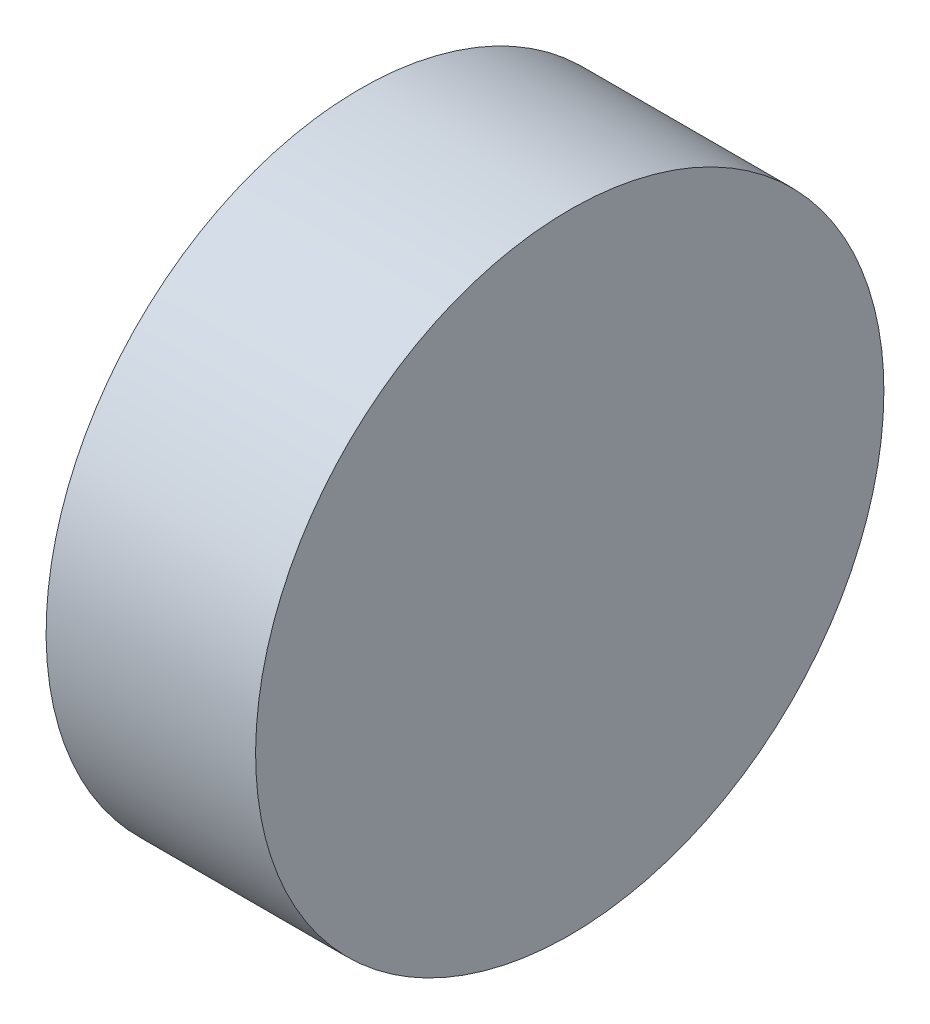
ISO-10303-21;
HEADER;
FILE_DESCRIPTION(('STEP AP214'),'2;1');
FILE_NAME('part.step','',(''),(''),'','','');
FILE_SCHEMA(('AUTOMOTIVE_DESIGN { 1 0 10303 214 1 1 1 1 }'));
ENDSEC;
DATA;
#1=APPLICATION_CONTEXT('core data for automotive mechanical design processes');
#2=APPLICATION_PROTOCOL_DEFINITION('international standard','automotive_design',2000,#1);
#3=PRODUCT_CONTEXT('',#1,'mechanical');
#4=PRODUCT('Part','Part','',(#3));
#5=PRODUCT_RELATED_PRODUCT_CATEGORY('part','',(#4));
#6=PRODUCT_DEFINITION_FORMATION('','',#4);
#7=PRODUCT_DEFINITION_CONTEXT('part definition',#1,'design');
#8=PRODUCT_DEFINITION('design','',#6,#7);
#9=PRODUCT_DEFINITION_SHAPE('','',#8);
#10=(LENGTH_UNIT() NAMED_UNIT(*) SI_UNIT(.MILLI.,.METRE.));
#11=(NAMED_UNIT(*) PLANE_ANGLE_UNIT() SI_UNIT($,.RADIAN.));
#12=(NAMED_UNIT(*) SI_UNIT($,.STERADIAN.) SOLID_ANGLE_UNIT());
#13=UNCERTAINTY_MEASURE_WITH_UNIT(LENGTH_MEASURE(1.E-05),#10,'distance_accuracy_value','');
#14=(GEOMETRIC_REPRESENTATION_CONTEXT(3) GLOBAL_UNCERTAINTY_ASSIGNED_CONTEXT((#13)) GLOBAL_UNIT_ASSIGNED_CONTEXT((#10,
#11,#12)) REPRESENTATION_CONTEXT('',''));
#15=CARTESIAN_POINT('',(0.,0.,0.));
#16=DIRECTION('',(0.,0.,1.));
#17=DIRECTION('',(1.,0.,0.));
#18=AXIS2_PLACEMENT_3D('',#15,#16,#17);
#19=CARTESIAN_POINT('',(480.480844217991,7.63540448629353,-6.68384776311004));
#20=CARTESIAN_POINT('',(480.480844217991,8.07285767052129,-6.68384776311004));
#21=CARTESIAN_POINT('',(480.480844217991,8.9477640389768,-6.59767700707474));
#22=CARTESIAN_POINT('',(480.480844217991,10.2096903500302,-6.21487584565985));
#23=CARTESIAN_POINT('',(480.480844217991,11.3726882990163,-5.59324049083884));
#24=CARTESIAN_POINT('',(480.480844217991,12.3920645269724,-4.75666004068037));
#25=CARTESIAN_POINT('',(480.480844217991,13.2286449771308,-3.73728381272428));
#26=CARTESIAN_POINT('',(480.480844217991,13.8502803319518,-2.57428586373817));
#27=CARTESIAN_POINT('',(480.480844217991,14.2330814933667,-1.3123595526848));
#28=CARTESIAN_POINT('',(480.480844217991,14.3623376274197,-1.53851373328506E-12));
#29=CARTESIAN_POINT('',(480.480844217991,14.2330814933667,1.31235955268173));
#30=CARTESIAN_POINT('',(480.480844217991,13.8502803319518,2.57428586373509));
#31=CARTESIAN_POINT('',(480.480844217991,13.2286449771308,3.7372838127212));
#32=CARTESIAN_POINT('',(480.480844217991,12.3920645269724,4.75666004067729));
#33=CARTESIAN_POINT('',(480.480844217991,11.3726882990163,5.59324049083577));
#34=CARTESIAN_POINT('',(480.480844217991,10.2096903500302,6.21487584565678));
#35=CARTESIAN_POINT('',(480.480844217991,8.9477640389768,6.59767700707166));
#36=CARTESIAN_POINT('',(480.480844217991,7.63540448629353,6.72693314112462));
#37=CARTESIAN_POINT('',(480.480844217991,6.32304493361027,6.59767700707166));
#38=CARTESIAN_POINT('',(480.480844217991,5.0611186225569,6.21487584565677));
#39=CARTESIAN_POINT('',(480.480844217991,3.8981206735708,5.59324049083577));
#40=CARTESIAN_POINT('',(480.480844217991,2.8787444456147,4.75666004067729));
#41=CARTESIAN_POINT('',(480.480844217991,2.04216399545623,3.7372838127212));
#42=CARTESIAN_POINT('',(480.480844217991,1.42052864063522,2.5742858637351));
#43=CARTESIAN_POINT('',(480.480844217991,1.03772747922033,1.31235955268173));
#44=CARTESIAN_POINT('',(480.480844217991,0.908471345167377,-1.53361543439531E-12));
#45=CARTESIAN_POINT('',(480.480844217991,1.03772747922034,-1.31235955268481));
#46=CARTESIAN_POINT('',(480.480844217991,1.42052864063522,-2.57428586373817));
#47=CARTESIAN_POINT('',(480.480844217991,2.04216399545623,-3.73728381272428));
#48=CARTESIAN_POINT('',(480.480844217991,2.8787444456147,-4.75666004068036));
#49=CARTESIAN_POINT('',(480.480844217991,3.89812067357079,-5.59324049083884));
#50=CARTESIAN_POINT('',(480.480844217991,5.0611186225569,-6.21487584565985));
#51=CARTESIAN_POINT('',(480.480844217991,6.32304493361026,-6.59767700707473));
#52=CARTESIAN_POINT('',(480.480844217991,7.19795130206578,-6.68384776311004));
#53=CARTESIAN_POINT('',(480.480844217991,7.63540448629353,-6.68384776311004));
#54=B_SPLINE_CURVE_WITH_KNOTS('',3,(#19,#20,#21,#22,#23,#24,#25,#26,#27,#28,#29,#30,#31,#32,#33,
#34,#35,#36,#37,#38,#39,#40,#41,#42,#43,#44,#45,#46,#47,#48,#49,#50,#51,#52,#53),.UNSPECIFIED.,
.T.,.F.,(4,1,1,1,1,1,1,1,1,1,1,1,1,1,1,1,1,1,1,1,1,1,1,1,1,1,1,1,1,1,1,1,4),(0.,0.03125,0.0625,
0.09375,0.125,0.15625,0.1875,0.21875,0.25,0.28125,0.3125,0.34375,0.375,0.40625,0.4375,0.46875,
0.5,0.53125,0.5625,0.59375,0.625,0.65625,0.6875,0.71875,0.75,0.78125,0.8125,0.84375,0.875,
0.90625,0.9375,0.96875,1.),.UNSPECIFIED.);
#55=DIRECTION('',(1.,0.,0.));
#56=VECTOR('',#55,1.);
#57=SURFACE_OF_LINEAR_EXTRUSION('',#54,#56);
#58=CARTESIAN_POINT('',(480.480844217991,7.63540448629353,-6.68384776311004));
#59=CARTESIAN_POINT('',(480.480844217991,8.07285767052129,-6.68384776311004));
#60=CARTESIAN_POINT('',(480.48084421799,8.9477640389768,-6.59767700707474));
#61=CARTESIAN_POINT('',(480.480844217991,10.2096903500302,-6.21487584565985));
#62=CARTESIAN_POINT('',(480.480844217991,11.3726882990163,-5.59324049083884));
#63=CARTESIAN_POINT('',(480.480844217991,12.3920645269724,-4.75666004068037));
#64=CARTESIAN_POINT('',(480.480844217991,13.2286449771308,-3.73728381272428));
#65=CARTESIAN_POINT('',(480.480844217991,13.8502803319518,-2.57428586373817));
#66=CARTESIAN_POINT('',(480.480844217991,14.2330814933667,-1.3123595526848));
#67=CARTESIAN_POINT('',(480.480844217991,14.3623376274197,-1.53851373328506E-12));
#68=CARTESIAN_POINT('',(480.480844217991,14.2330814933667,1.31235955268173));
#69=CARTESIAN_POINT('',(480.480844217991,13.8502803319518,2.57428586373509));
#70=CARTESIAN_POINT('',(480.480844217991,13.2286449771308,3.7372838127212));
#71=CARTESIAN_POINT('',(480.480844217991,12.3920645269724,4.75666004067729));
#72=CARTESIAN_POINT('',(480.48084421799,11.3726882990163,5.59324049083577));
#73=CARTESIAN_POINT('',(480.480844217991,10.2096903500302,6.21487584565678));
#74=CARTESIAN_POINT('',(480.480844217991,8.9477640389768,6.59767700707166));
#75=CARTESIAN_POINT('',(480.480844217991,7.63540448629353,6.72693314112462));
#76=CARTESIAN_POINT('',(480.480844217991,6.32304493361027,6.59767700707166));
#77=CARTESIAN_POINT('',(480.48084421799,5.0611186225569,6.21487584565677));
#78=CARTESIAN_POINT('',(480.480844217991,3.8981206735708,5.59324049083577));
#79=CARTESIAN_POINT('',(480.480844217991,2.8787444456147,4.75666004067729));
#80=CARTESIAN_POINT('',(480.48084421799,2.04216399545623,3.7372838127212));
#81=CARTESIAN_POINT('',(480.480844217991,1.42052864063522,2.5742858637351));
#82=CARTESIAN_POINT('',(480.48084421799,1.03772747922033,1.31235955268173));
#83=CARTESIAN_POINT('',(480.48084421799,0.908471345167377,-1.53361543439531E-12));
#84=CARTESIAN_POINT('',(480.480844217991,1.03772747922034,-1.31235955268481));
#85=CARTESIAN_POINT('',(480.48084421799,1.42052864063522,-2.57428586373817));
#86=CARTESIAN_POINT('',(480.48084421799,2.04216399545623,-3.73728381272428));
#87=CARTESIAN_POINT('',(480.480844217991,2.8787444456147,-4.75666004068036));
#88=CARTESIAN_POINT('',(480.480844217991,3.89812067357079,-5.59324049083884));
#89=CARTESIAN_POINT('',(480.480844217991,5.0611186225569,-6.21487584565985));
#90=CARTESIAN_POINT('',(480.480844217991,6.32304493361026,-6.59767700707473));
#91=CARTESIAN_POINT('',(480.480844217991,7.19795130206578,-6.68384776311004));
#92=CARTESIAN_POINT('',(480.480844217991,7.63540448629353,-6.68384776311004));
#93=B_SPLINE_CURVE_WITH_KNOTS('',3,(#58,#59,#60,#61,#62,#63,#64,#65,#66,#67,#68,#69,#70,#71,#72,
#73,#74,#75,#76,#77,#78,#79,#80,#81,#82,#83,#84,#85,#86,#87,#88,#89,#90,#91,#92),.UNSPECIFIED.,
.T.,.F.,(4,1,1,1,1,1,1,1,1,1,1,1,1,1,1,1,1,1,1,1,1,1,1,1,1,1,1,1,1,1,1,1,4),(0.,0.03125,0.0625,
0.09375,0.125,0.15625,0.1875,0.21875,0.25,0.28125,0.3125,0.34375,0.375,0.40625,0.4375,0.46875,
0.5,0.53125,0.5625,0.59375,0.625,0.65625,0.6875,0.71875,0.75,0.78125,0.8125,0.84375,0.875,
0.90625,0.9375,0.96875,1.),.UNSPECIFIED.);
#94=CARTESIAN_POINT('',(480.480844217991,7.63540448629353,-6.68384776311004));
#95=VERTEX_POINT('',#94);
#96=EDGE_CURVE('E10',#95,#95,#93,.T.);
#97=ORIENTED_EDGE('',*,*,#96,.T.);
#98=EDGE_LOOP('',(#97));
#99=FACE_BOUND('',#98,.T.);
#100=CARTESIAN_POINT('',(484.93803885139,7.63540448629352,-6.68384776311006));
#101=CARTESIAN_POINT('',(484.93803885139,7.52604051870637,-6.68384774042561));
#102=CARTESIAN_POINT('',(484.93803885139,7.41667734705627,-6.6811548948248));
#103=CARTESIAN_POINT('',(484.93803885139,7.19821367382525,-6.67040944394967));
#104=CARTESIAN_POINT('',(484.93803885139,7.08911317429132,-6.66235679704149));
#105=CARTESIAN_POINT('',(484.93803885139,6.87143763068036,-6.64091763051648));
#106=CARTESIAN_POINT('',(484.93803885139,6.76286258660333,-6.62753111089966));
#107=CARTESIAN_POINT('',(484.93803885139,6.54650007189963,-6.59544990734162));
#108=CARTESIAN_POINT('',(484.938038851389,6.43871259516178,-6.57675526463412));
#109=CARTESIAN_POINT('',(484.938038851389,6.22418835260203,-6.53408374039474));
#110=CARTESIAN_POINT('',(484.938038851389,6.11745158678013,-6.51010685886284));
#111=CARTESIAN_POINT('',(484.938038851389,5.90528172735102,-6.45694767054929));
#112=CARTESIAN_POINT('',(484.938038851389,5.79984864387704,-6.42776532333391));
#113=CARTESIAN_POINT('',(484.938038851389,5.59053831244416,-6.36427172853538));
#114=CARTESIAN_POINT('',(484.938038851389,5.48666106448526,-6.32996048095223));
#115=CARTESIAN_POINT('',(484.938038851389,5.28071461008578,-6.2562854717582));
#116=CARTESIAN_POINT('',(484.938038851389,5.17864538960691,-6.21692174939644));
#117=CARTESIAN_POINT('',(484.93803885139,4.97656797619596,-6.13321854412126));
#118=CARTESIAN_POINT('',(484.93803885139,4.87655978326387,-6.08887906120783));
#119=CARTESIAN_POINT('',(484.93803885139,4.6788375501305,-5.99534902528478));
#120=CARTESIAN_POINT('',(484.938038851389,4.58112352775598,-5.94615843459525));
#121=CARTESIAN_POINT('',(484.938038851389,4.38822202183408,-5.84305043153917));
#122=CARTESIAN_POINT('',(484.93803885139,4.2930345382867,-5.78913301917261));
#123=CARTESIAN_POINT('',(484.93803885139,4.10541856844062,-5.67669549449248));
#124=CARTESIAN_POINT('',(484.938038851389,4.01299006071624,-5.61817541793515));
#125=CARTESIAN_POINT('',(484.938038851389,3.83112519343533,-5.49665719863009));
#126=CARTESIAN_POINT('',(484.938038851389,3.74168883387878,-5.43365905588236));
#127=CARTESIAN_POINT('',(484.938038851389,3.56601258283321,-5.30335247924012));
#128=CARTESIAN_POINT('',(484.938038851389,3.47977271617938,-5.23604401186754));
#129=CARTESIAN_POINT('',(484.938038851389,3.31069313212391,-5.09728398327108));
#130=CARTESIAN_POINT('',(484.938038851389,3.22785341472226,-5.02583242204721));
#131=CARTESIAN_POINT('',(484.938038851389,3.06577790602474,-4.87895329290321));
#132=CARTESIAN_POINT('',(484.938038851389,2.98654208673918,-4.80352575587233));
#133=CARTESIAN_POINT('',(484.938038851389,2.83187873042274,-4.6488623995559));
#134=CARTESIAN_POINT('',(484.938038851389,2.75645119339186,-4.56962658027034));
#135=CARTESIAN_POINT('',(484.938038851389,2.60957206424787,-4.40755107157281));
#136=CARTESIAN_POINT('',(484.938038851389,2.538120503024,-4.32471135417117));
#137=CARTESIAN_POINT('',(484.938038851389,2.39936047442754,-4.1556317701157));
#138=CARTESIAN_POINT('',(484.938038851389,2.33205200705496,-4.06939190346189));
#139=CARTESIAN_POINT('',(484.938038851389,2.20174543041271,-3.89371565241628));
#140=CARTESIAN_POINT('',(484.938038851389,2.13874728766499,-3.80427929285969));
#141=CARTESIAN_POINT('',(484.938038851389,2.01722906835993,-3.6224144255789));
#142=CARTESIAN_POINT('',(484.938038851389,1.95870899180261,-3.5299859178547));
#143=CARTESIAN_POINT('',(484.938038851389,1.84627146712246,-3.34236994800815));
#144=CARTESIAN_POINT('',(484.938038851389,1.79235405475587,-3.24718246446013));
#145=CARTESIAN_POINT('',(484.938038851389,1.68924605169987,-3.05428095853998));
#146=CARTESIAN_POINT('',(484.938038851389,1.64005546101046,-2.95656693616785));
#147=CARTESIAN_POINT('',(484.938038851389,1.54652542508708,-2.75884470302794));
#148=CARTESIAN_POINT('',(484.938038851389,1.50218594217321,-2.65883651008692));
#149=CARTESIAN_POINT('',(484.938038851389,1.41848273689924,-2.45675909670038));
#150=CARTESIAN_POINT('',(484.938038851389,1.37911901453913,-2.35468987625487));
#151=CARTESIAN_POINT('',(484.938038851389,1.30544400534059,-2.14874342176425));
#152=CARTESIAN_POINT('',(484.938038851389,1.2711327577513,-2.04486617368085));
#153=CARTESIAN_POINT('',(484.938038851389,1.20763916296956,-1.83555584258812));
#154=CARTESIAN_POINT('',(484.938038851389,1.17845681577712,-1.73012275957878));
#155=CARTESIAN_POINT('',(484.938038851389,1.1252976274009,-1.51795289888023));
#156=CARTESIAN_POINT('',(484.938038851389,1.1013207457834,-1.41121613132426));
#157=CARTESIAN_POINT('',(484.938038851389,1.05864922177788,-1.1966918935021));
#158=CARTESIAN_POINT('',(484.938038851389,1.03995457938986,-1.08890442323593));
#159=CARTESIAN_POINT('',(484.938038851389,1.00787337495902,-0.872541890851208));
#160=CARTESIAN_POINT('',(484.938038851389,0.994486854149904,-0.763966822621245));
#161=CARTESIAN_POINT('',(484.938038851389,0.973047690882274,-0.546291344997234));
#162=CARTESIAN_POINT('',(484.938038851389,0.964995048423755,-0.437190935603185));
#163=CARTESIAN_POINT('',(484.938038851389,0.954249585391968,-0.218727016106409));
#164=CARTESIAN_POINT('',(484.938038851389,0.951556723185015,-0.109363508053985));
#165=CARTESIAN_POINT('',(484.938038851389,0.951556723185014,0.109363508050861));
#166=CARTESIAN_POINT('',(484.938038851389,0.954249585391967,0.218727016103285));
#167=CARTESIAN_POINT('',(484.938038851389,0.964995048423752,0.43719093560006));
#168=CARTESIAN_POINT('',(484.938038851389,0.973047690882271,0.546291344994108));
#169=CARTESIAN_POINT('',(484.938038851389,0.994486854149901,0.763966822618119));
#170=CARTESIAN_POINT('',(484.938038851389,1.00787337495901,0.872541890848081));
#171=CARTESIAN_POINT('',(484.938038851389,1.03995457938985,1.0889044232328));
#172=CARTESIAN_POINT('',(484.938038851389,1.05864922177788,1.19669189349897));
#173=CARTESIAN_POINT('',(484.938038851389,1.1013207457834,1.41121613132113));
#174=CARTESIAN_POINT('',(484.938038851389,1.12529762740089,1.51795289887711));
#175=CARTESIAN_POINT('',(484.938038851389,1.17845681577712,1.73012275957566));
#176=CARTESIAN_POINT('',(484.938038851389,1.20763916296956,1.83555584258499));
#177=CARTESIAN_POINT('',(484.938038851389,1.27113275775129,2.04486617367773));
#178=CARTESIAN_POINT('',(484.938038851389,1.30544400534059,2.14874342176113));
#179=CARTESIAN_POINT('',(484.938038851389,1.37911901453912,2.35468987625175));
#180=CARTESIAN_POINT('',(484.938038851389,1.41848273689923,2.45675909669726));
#181=CARTESIAN_POINT('',(484.938038851389,1.50218594217321,2.65883651008379));
#182=CARTESIAN_POINT('',(484.938038851389,1.54652542508707,2.75884470302482));
#183=CARTESIAN_POINT('',(484.938038851389,1.64005546101045,2.95656693616473));
#184=CARTESIAN_POINT('',(484.938038851389,1.68924605169986,3.05428095853686));
#185=CARTESIAN_POINT('',(484.938038851389,1.79235405475586,3.24718246445701));
#186=CARTESIAN_POINT('',(484.938038851389,1.84627146712245,3.34236994800503));
#187=CARTESIAN_POINT('',(484.938038851389,1.9587089918026,3.52998591785158));
#188=CARTESIAN_POINT('',(484.938038851389,2.01722906835993,3.62241442557578));
#189=CARTESIAN_POINT('',(484.938038851389,2.13874728766498,3.80427929285657));
#190=CARTESIAN_POINT('',(484.938038851389,2.2017454304127,3.89371565241316));
#191=CARTESIAN_POINT('',(484.938038851389,2.33205200705495,4.06939190345877));
#192=CARTESIAN_POINT('',(484.938038851389,2.39936047442753,4.15563177011258));
#193=CARTESIAN_POINT('',(484.938038851389,2.53812050302398,4.32471135416805));
#194=CARTESIAN_POINT('',(484.938038851389,2.60957206424786,4.4075510715697));
#195=CARTESIAN_POINT('',(484.938038851389,2.75645119339185,4.56962658026723));
#196=CARTESIAN_POINT('',(484.93803885139,2.83187873042273,4.64886239955278));
#197=CARTESIAN_POINT('',(484.93803885139,2.98654208673917,4.80352575586922));
#198=CARTESIAN_POINT('',(484.938038851389,3.06577790602473,4.8789532929001));
#199=CARTESIAN_POINT('',(484.938038851389,3.22785341472225,5.0258324220441));
#200=CARTESIAN_POINT('',(484.938038851389,3.3106931321239,5.09728398326797));
#201=CARTESIAN_POINT('',(484.93803885139,3.47977271617937,5.23604401186442));
#202=CARTESIAN_POINT('',(484.93803885139,3.56601258283319,5.303352479237));
#203=CARTESIAN_POINT('',(484.93803885139,3.74168883387879,5.43365905587925));
#204=CARTESIAN_POINT('',(484.93803885139,3.83112519343538,5.49665719862698));
#205=CARTESIAN_POINT('',(484.938038851389,4.01299006071617,5.61817541793203));
#206=CARTESIAN_POINT('',(484.938038851389,4.10541856844037,5.67669549448936));
#207=CARTESIAN_POINT('',(484.938038851389,4.29303453828692,5.78913301916951));
#208=CARTESIAN_POINT('',(484.938038851389,4.38822202183494,5.8430504315361));
#209=CARTESIAN_POINT('',(484.938038851389,4.58112352775509,5.9461584345921));
#210=CARTESIAN_POINT('',(484.938038851389,4.67883755012722,5.9953490252815));
#211=CARTESIAN_POINT('',(484.938038851389,4.87655978326713,6.08887906120488));
#212=CARTESIAN_POINT('',(484.938038851389,4.97656797620815,6.13321854411875));
#213=CARTESIAN_POINT('',(484.938038851389,5.17864538959469,6.21692174939272));
#214=CARTESIAN_POINT('',(484.938038851389,5.2807146100402,6.25628547175284));
#215=CARTESIAN_POINT('',(484.938038851389,5.48666106453082,6.32996048095137));
#216=CARTESIAN_POINT('',(484.938038851389,5.59053831261422,6.36427172854066));
#217=CARTESIAN_POINT('',(484.938038851389,5.79984864370695,6.4277653233224));
#218=CARTESIAN_POINT('',(484.938038851389,5.90528172671629,6.45694767051484));
#219=CARTESIAN_POINT('',(484.938038851389,6.11745158741484,6.51010685889107));
#220=CARTESIAN_POINT('',(484.93803885139,6.22418835497082,6.53408374050856));
#221=CARTESIAN_POINT('',(484.93803885139,6.43871259279297,6.57675526451408));
#222=CARTESIAN_POINT('',(484.938038851389,6.54650006305915,6.59544990690211));
#223=CARTESIAN_POINT('',(484.938038851389,6.76286259544387,6.62753111133295));
#224=CARTESIAN_POINT('',(484.93803885139,6.87143766367383,6.64091763214206));
#225=CARTESIAN_POINT('',(484.93803885139,7.08911314129784,6.66235679540969));
#226=CARTESIAN_POINT('',(484.938038851389,7.19821355069189,6.67040943786821));
#227=CARTESIAN_POINT('',(484.938038851389,7.41667747018866,6.6811549009));
#228=CARTESIAN_POINT('',(484.938038851389,7.52604097824109,6.68384776310695));
#229=CARTESIAN_POINT('',(484.938038851389,7.74476799434593,6.68384776310695));
#230=CARTESIAN_POINT('',(484.938038851389,7.85413150239836,6.6811549009));
#231=CARTESIAN_POINT('',(484.938038851389,8.07259542189513,6.67040943786821));
#232=CARTESIAN_POINT('',(484.93803885139,8.18169583128918,6.66235679540969));
#233=CARTESIAN_POINT('',(484.93803885139,8.39937130891319,6.64091763214206));
#234=CARTESIAN_POINT('',(484.93803885139,8.50794637714316,6.62753111133295));
#235=CARTESIAN_POINT('',(484.93803885139,8.72430890952787,6.59544990690211));
#236=CARTESIAN_POINT('',(484.93803885139,8.83209637979405,6.57675526451409));
#237=CARTESIAN_POINT('',(484.93803885139,9.04662061761621,6.53408374050857));
#238=CARTESIAN_POINT('',(484.93803885139,9.15335738517218,6.51010685889107));
#239=CARTESIAN_POINT('',(484.93803885139,9.36552724587074,6.45694767051485));
#240=CARTESIAN_POINT('',(484.93803885139,9.47096032888007,6.42776532332241));
#241=CARTESIAN_POINT('',(484.93803885139,9.68027065997281,6.36427172854067));
#242=CARTESIAN_POINT('',(484.93803885139,9.7841479080562,6.32996048095138));
#243=CARTESIAN_POINT('',(484.93803885139,9.99009436254682,6.25628547175284));
#244=CARTESIAN_POINT('',(484.93803885139,10.0921635829923,6.21692174939273));
#245=CARTESIAN_POINT('',(484.93803885139,10.2942409963789,6.13321854411875));
#246=CARTESIAN_POINT('',(484.93803885139,10.3942491893199,6.08887906120489));
#247=CARTESIAN_POINT('',(484.938038851389,10.5919714224598,5.99534902528151));
#248=CARTESIAN_POINT('',(484.938038851389,10.6896854448319,5.9461584345921));
#249=CARTESIAN_POINT('',(484.938038851389,10.8825869507521,5.8430504315361));
#250=CARTESIAN_POINT('',(484.93803885139,10.9777744343001,5.78913301916951));
#251=CARTESIAN_POINT('',(484.93803885139,11.1653904041467,5.67669549448936));
#252=CARTESIAN_POINT('',(484.938038851389,11.2578189118709,5.61817541793204));
#253=CARTESIAN_POINT('',(484.938038851389,11.4396837791516,5.49665719862699));
#254=CARTESIAN_POINT('',(484.938038851389,11.5291201387082,5.43365905587926));
#255=CARTESIAN_POINT('',(484.938038851389,11.7047963897538,5.30335247923701));
#256=CARTESIAN_POINT('',(484.938038851389,11.7910362564077,5.23604401186443));
#257=CARTESIAN_POINT('',(484.938038851389,11.9601158404631,5.09728398326797));
#258=CARTESIAN_POINT('',(484.938038851389,12.0429555578648,5.0258324220441));
#259=CARTESIAN_POINT('',(484.938038851389,12.2050310665623,4.87895329290011));
#260=CARTESIAN_POINT('',(484.93803885139,12.2842668858479,4.80352575586923));
#261=CARTESIAN_POINT('',(484.93803885139,12.4389302421643,4.64886239955279));
#262=CARTESIAN_POINT('',(484.93803885139,12.5143577791952,4.56962658026723));
#263=CARTESIAN_POINT('',(484.93803885139,12.6612369083392,4.40755107156971));
#264=CARTESIAN_POINT('',(484.93803885139,12.732688469563,4.32471135416806));
#265=CARTESIAN_POINT('',(484.93803885139,12.8714484981595,4.15563177011259));
#266=CARTESIAN_POINT('',(484.93803885139,12.9387569655321,4.06939190345878));
#267=CARTESIAN_POINT('',(484.93803885139,13.0690635421743,3.89371565241317));
#268=CARTESIAN_POINT('',(484.93803885139,13.1320616849221,3.80427929285658));
#269=CARTESIAN_POINT('',(484.93803885139,13.2535799042271,3.62241442557579));
#270=CARTESIAN_POINT('',(484.93803885139,13.3120999807844,3.52998591785159));
#271=CARTESIAN_POINT('',(484.93803885139,13.4245375054646,3.34236994800504));
#272=CARTESIAN_POINT('',(484.93803885139,13.4784549178312,3.24718246445702));
#273=CARTESIAN_POINT('',(484.93803885139,13.5815629208872,3.05428095853687));
#274=CARTESIAN_POINT('',(484.93803885139,13.6307535115766,2.95656693616474));
#275=CARTESIAN_POINT('',(484.93803885139,13.7242835475,2.75884470302483));
#276=CARTESIAN_POINT('',(484.93803885139,13.7686230304138,2.65883651008381));
#277=CARTESIAN_POINT('',(484.93803885139,13.8523262356878,2.45675909669727));
#278=CARTESIAN_POINT('',(484.93803885139,13.8916899580479,2.35468987625176));
#279=CARTESIAN_POINT('',(484.93803885139,13.9653649672464,2.14874342176114));
#280=CARTESIAN_POINT('',(484.93803885139,13.9996762148357,2.04486617367774));
#281=CARTESIAN_POINT('',(484.93803885139,14.0631698096175,1.83555584258501));
#282=CARTESIAN_POINT('',(484.93803885139,14.0923521568099,1.73012275957567));
#283=CARTESIAN_POINT('',(484.93803885139,14.1455113451861,1.51795289887712));
#284=CARTESIAN_POINT('',(484.938038851389,14.1694882268036,1.41121613132114));
#285=CARTESIAN_POINT('',(484.938038851389,14.2121597508092,1.19669189349899));
#286=CARTESIAN_POINT('',(484.938038851389,14.2308543931972,1.08890442323281));
#287=CARTESIAN_POINT('',(484.938038851389,14.262935597628,0.872541890848096));
#288=CARTESIAN_POINT('',(484.93803885139,14.2763221184371,0.763966822618133));
#289=CARTESIAN_POINT('',(484.93803885139,14.2977612817048,0.546291344994122));
#290=CARTESIAN_POINT('',(484.93803885139,14.3058139241633,0.437190935600073));
#291=CARTESIAN_POINT('',(484.93803885139,14.3165593871951,0.218727016103297));
#292=CARTESIAN_POINT('',(484.93803885139,14.319252249402,0.109363508050874));
#293=CARTESIAN_POINT('',(484.93803885139,14.319252249402,-0.109363508053973));
#294=CARTESIAN_POINT('',(484.93803885139,14.3165593871951,-0.218727016106397));
#295=CARTESIAN_POINT('',(484.93803885139,14.3058139241633,-0.437190935603173));
#296=CARTESIAN_POINT('',(484.93803885139,14.2977612817048,-0.546291344997222));
#297=CARTESIAN_POINT('',(484.93803885139,14.2763221184371,-0.763966822621233));
#298=CARTESIAN_POINT('',(484.93803885139,14.262935597628,-0.872541890851195));
#299=CARTESIAN_POINT('',(484.93803885139,14.2308543931972,-1.08890442323591));
#300=CARTESIAN_POINT('',(484.93803885139,14.2121597508092,-1.19669189350209));
#301=CARTESIAN_POINT('',(484.93803885139,14.1694882268036,-1.41121613132424));
#302=CARTESIAN_POINT('',(484.93803885139,14.1455113451861,-1.51795289888022));
#303=CARTESIAN_POINT('',(484.93803885139,14.0923521568099,-1.73012275957877));
#304=CARTESIAN_POINT('',(484.93803885139,14.0631698096175,-1.83555584258811));
#305=CARTESIAN_POINT('',(484.93803885139,13.9996762148357,-2.04486617368084));
#306=CARTESIAN_POINT('',(484.93803885139,13.9653649672464,-2.14874342176424));
#307=CARTESIAN_POINT('',(484.93803885139,13.8916899580479,-2.35468987625486));
#308=CARTESIAN_POINT('',(484.93803885139,13.8523262356878,-2.45675909670037));
#309=CARTESIAN_POINT('',(484.93803885139,13.7686230304138,-2.65883651008691));
#310=CARTESIAN_POINT('',(484.93803885139,13.7242835475,-2.75884470302793));
#311=CARTESIAN_POINT('',(484.93803885139,13.6307535115766,-2.95656693616784));
#312=CARTESIAN_POINT('',(484.93803885139,13.5815629208872,-3.05428095853997));
#313=CARTESIAN_POINT('',(484.93803885139,13.4784549178312,-3.24718246446012));
#314=CARTESIAN_POINT('',(484.93803885139,13.4245375054646,-3.34236994800814));
#315=CARTESIAN_POINT('',(484.93803885139,13.3120999807844,-3.52998591785469));
#316=CARTESIAN_POINT('',(484.93803885139,13.2535799042271,-3.6224144255789));
#317=CARTESIAN_POINT('',(484.93803885139,13.1320616849221,-3.80427929285969));
#318=CARTESIAN_POINT('',(484.938038851389,13.0690635421743,-3.89371565241627));
#319=CARTESIAN_POINT('',(484.938038851389,12.9387569655321,-4.06939190346188));
#320=CARTESIAN_POINT('',(484.93803885139,12.8714484981595,-4.1556317701157));
#321=CARTESIAN_POINT('',(484.93803885139,12.732688469563,-4.32471135417116));
#322=CARTESIAN_POINT('',(484.93803885139,12.6612369083392,-4.40755107157281));
#323=CARTESIAN_POINT('',(484.93803885139,12.5143577791952,-4.56962658027034));
#324=CARTESIAN_POINT('',(484.93803885139,12.4389302421643,-4.64886239955589));
#325=CARTESIAN_POINT('',(484.93803885139,12.2842668858479,-4.80352575587233));
#326=CARTESIAN_POINT('',(484.938038851389,12.2050310665623,-4.87895329290321));
#327=CARTESIAN_POINT('',(484.938038851389,12.0429555578648,-5.02583242204721));
#328=CARTESIAN_POINT('',(484.93803885139,11.9601158404631,-5.09728398327108));
#329=CARTESIAN_POINT('',(484.93803885139,11.7910362564077,-5.23604401186753));
#330=CARTESIAN_POINT('',(484.93803885139,11.7047963897538,-5.30335247924011));
#331=CARTESIAN_POINT('',(484.93803885139,11.5291201387083,-5.43365905588236));
#332=CARTESIAN_POINT('',(484.93803885139,11.4396837791517,-5.49665719863008));
#333=CARTESIAN_POINT('',(484.93803885139,11.2578189118708,-5.61817541793514));
#334=CARTESIAN_POINT('',(484.93803885139,11.1653904041464,-5.67669549449248));
#335=CARTESIAN_POINT('',(484.93803885139,10.9777744343003,-5.7891330191726));
#336=CARTESIAN_POINT('',(484.93803885139,10.882586950753,-5.84305043153916));
#337=CARTESIAN_POINT('',(484.93803885139,10.6896854448311,-5.94615843459525));
#338=CARTESIAN_POINT('',(484.93803885139,10.5919714224565,-5.99534902528477));
#339=CARTESIAN_POINT('',(484.93803885139,10.3942491893232,-6.08887906120783));
#340=CARTESIAN_POINT('',(484.938038851389,10.2942409963911,-6.13321854412126));
#341=CARTESIAN_POINT('',(484.938038851389,10.0921635829801,-6.21692174939644));
#342=CARTESIAN_POINT('',(484.938038851389,9.99009436250126,-6.2562854717582));
#343=CARTESIAN_POINT('',(484.938038851389,9.78414790810178,-6.32996048095223));
#344=CARTESIAN_POINT('',(484.938038851389,9.68027066014288,-6.36427172853538));
#345=CARTESIAN_POINT('',(484.938038851389,9.47096032871,-6.42776532333391));
#346=CARTESIAN_POINT('',(484.938038851389,9.36552724523601,-6.45694767054928));
#347=CARTESIAN_POINT('',(484.938038851389,9.15335738580691,-6.51010685886284));
#348=CARTESIAN_POINT('',(484.938038851389,9.04662061998501,-6.53408374039474));
#349=CARTESIAN_POINT('',(484.938038851389,8.83209637742526,-6.57675526463413));
#350=CARTESIAN_POINT('',(484.93803885139,8.7243089006874,-6.59544990734162));
#351=CARTESIAN_POINT('',(484.93803885139,8.5079463859837,-6.62753111089966));
#352=CARTESIAN_POINT('',(484.93803885139,8.39937134190667,-6.64091763051648));
#353=CARTESIAN_POINT('',(484.93803885139,8.18169579829571,-6.66235679704149));
#354=CARTESIAN_POINT('',(484.93803885139,8.07259529876178,-6.67040944394967));
#355=CARTESIAN_POINT('',(484.93803885139,7.85413162553076,-6.68115489482481));
#356=CARTESIAN_POINT('',(484.93803885139,7.74476845388066,-6.68384774042562));
#357=CARTESIAN_POINT('',(484.93803885139,7.63540448629352,-6.68384776311006));
#358=B_SPLINE_CURVE_WITH_KNOTS('',3,(#100,#101,#102,#103,#104,#105,#106,#107,#108,#109,#110,
#111,#112,#113,#114,#115,#116,#117,#118,#119,#120,#121,#122,#123,#124,#125,#126,#127,#128,#129,
#130,#131,#132,#133,#134,#135,#136,#137,#138,#139,#140,#141,#142,#143,#144,#145,#146,#147,#148,
#149,#150,#151,#152,#153,#154,#155,#156,#157,#158,#159,#160,#161,#162,#163,#164,#165,#166,#167,
#168,#169,#170,#171,#172,#173,#174,#175,#176,#177,#178,#179,#180,#181,#182,#183,#184,#185,#186,
#187,#188,#189,#190,#191,#192,#193,#194,#195,#196,#197,#198,#199,#200,#201,#202,#203,#204,#205,
#206,#207,#208,#209,#210,#211,#212,#213,#214,#215,#216,#217,#218,#219,#220,#221,#222,#223,#224,
#225,#226,#227,#228,#229,#230,#231,#232,#233,#234,#235,#236,#237,#238,#239,#240,#241,#242,#243,
#244,#245,#246,#247,#248,#249,#250,#251,#252,#253,#254,#255,#256,#257,#258,#259,#260,#261,#262,
#263,#264,#265,#266,#267,#268,#269,#270,#271,#272,#273,#274,#275,#276,#277,#278,#279,#280,#281,
#282,#283,#284,#285,#286,#287,#288,#289,#290,#291,#292,#293,#294,#295,#296,#297,#298,#299,#300,
#301,#302,#303,#304,#305,#306,#307,#308,#309,#310,#311,#312,#313,#314,#315,#316,#317,#318,#319,
#320,#321,#322,#323,#324,#325,#326,#327,#328,#329,#330,#331,#332,#333,#334,#335,#336,#337,#338,
#339,#340,#341,#342,#343,#344,#345,#346,#347,#348,#349,#350,#351,#352,#353,#354,#355,#356,#357),
.UNSPECIFIED.,.F.,.F.,(4,2,2,2,2,2,2,2,2,2,2,2,2,2,2,2,2,2,2,2,2,2,2,2,2,2,2,2,2,2,2,2,2,2,2,2,
2,2,2,2,2,2,2,2,2,2,2,2,2,2,2,2,2,2,2,2,2,2,2,2,2,2,2,2,2,2,2,2,2,2,2,2,2,2,2,2,2,2,2,2,2,2,2,2,
2,2,2,2,2,2,2,2,2,2,2,2,2,2,2,2,2,2,2,2,2,2,2,2,2,2,2,2,2,2,2,2,2,2,2,2,2,2,2,2,2,2,2,2,4),(0.,
0.328057716013095,0.656117980341761,0.984178244670427,1.31223596068352,1.64029367669662,
1.96835394102528,2.29641420535395,2.62447192136704,2.95252963738014,3.2805899017088,
3.60865016603747,3.93670788205056,4.26476559806366,4.59282586239233,4.92088612672099,
5.24894384273409,5.57700155874718,5.90506182307585,6.23312208740451,6.56117980341761,
6.8892375194307,7.21729778375937,7.54535804808804,7.87341576410113,8.20147348011423,
8.52953374444289,8.85759400877155,9.18565172478465,9.51370944079775,9.84176970512641,
10.1698299694551,10.4978876854682,10.8259454014813,11.1540056658099,11.4820659301386,
11.8101236461517,12.1381813621648,12.4662416264935,12.7943018908221,13.1223596068352,
13.4504173228483,13.778477587177,14.1065378515056,14.4345955675187,14.7626532835318,
15.0907135478605,15.4187738121892,15.7468315282023,16.0748892442154,16.402949508544,
16.7310097728727,17.0590674888858,17.3871252048989,17.7151854692275,18.0432457335562,
18.3713034495693,18.6993611655824,19.0274214299111,19.3554816942397,19.6835394102528,
20.0115971262659,20.3396573905946,20.6677176549233,20.9957753709364,21.3238330869495,
21.6518933512781,21.9799536156068,22.3080113316199,22.636069047633,22.9641293119616,
23.2921895762903,23.6202472923034,23.9483050083165,24.2763652726452,24.6044255369738,
24.9324832529869,25.260540969,25.5886012333287,25.9166614976574,26.2447192136705,
26.5727769296835,26.9008371940122,27.2288974583409,27.556955174354,27.8850128903671,
28.2130731546957,28.5411334190244,28.8691911350375,29.1972488510506,29.5253091153793,
29.8533693797079,30.181427095721,30.5094848117341,30.8375450760628,31.1656053403914,
31.4936630564045,31.8217207724176,32.1497810367463,32.477841301075,32.8058990170881,
33.1339567331012,33.4620169974298,33.7900772617585,34.1181349777716,34.4461926937847,
34.7742529581134,35.102313222442,35.4303709384551,35.7584286544682,36.0864889187969,
36.4145491831256,36.7426068991387,37.0706646151517,37.3987248794804,37.7267851438091,
38.0548428598222,38.3829005758353,38.7109608401639,39.0390211044926,39.3670788205057,
39.6951365365188,40.0231968008475,40.3512570651761,40.6793147811892,41.0073724972023,
41.335432761531,41.6634930258597,41.9915507418727),.UNSPECIFIED.);
#359=CARTESIAN_POINT('',(484.93803885139,7.63540448629352,-6.68384776311006));
#360=VERTEX_POINT('',#359);
#361=EDGE_CURVE('E25',#360,#360,#358,.F.);
#362=ORIENTED_EDGE('',*,*,#361,.F.);
#363=EDGE_LOOP('',(#362));
#364=FACE_BOUND('',#363,.T.);
#365=ADVANCED_FACE('F15',(#99,#364),#57,.T.);
#366=CARTESIAN_POINT('',(480.480844217991,14.1354044862935,-1.53867518978923E-12));
#367=DIRECTION('',(1.,0.,0.));
#368=DIRECTION('',(0.,1.,0.));
#369=AXIS2_PLACEMENT_3D('',#366,#367,#368);
#370=PLANE('',#369);
#371=ORIENTED_EDGE('',*,*,#96,.F.);
#372=EDGE_LOOP('',(#371));
#373=FACE_BOUND('',#372,.T.);
#374=ADVANCED_FACE('F63',(#373),#370,.F.);
#375=CARTESIAN_POINT('',(484.93803885139,14.1354044862935,-1.55423740167534E-12));
#376=DIRECTION('',(1.,0.,0.));
#377=DIRECTION('',(0.,1.,0.));
#378=AXIS2_PLACEMENT_3D('',#375,#376,#377);
#379=PLANE('',#378);
#380=ORIENTED_EDGE('',*,*,#361,.T.);
#381=EDGE_LOOP('',(#380));
#382=FACE_BOUND('',#381,.T.);
#383=ADVANCED_FACE('F32',(#382),#379,.T.);
#384=CLOSED_SHELL('',(#365,#374,#383));
#385=MANIFOLD_SOLID_BREP('B1',#384);
#386=ADVANCED_BREP_SHAPE_REPRESENTATION('',(#18,#385),#14);
#387=SHAPE_DEFINITION_REPRESENTATION(#9,#386);
ENDSEC;
END-ISO-10303-21;
